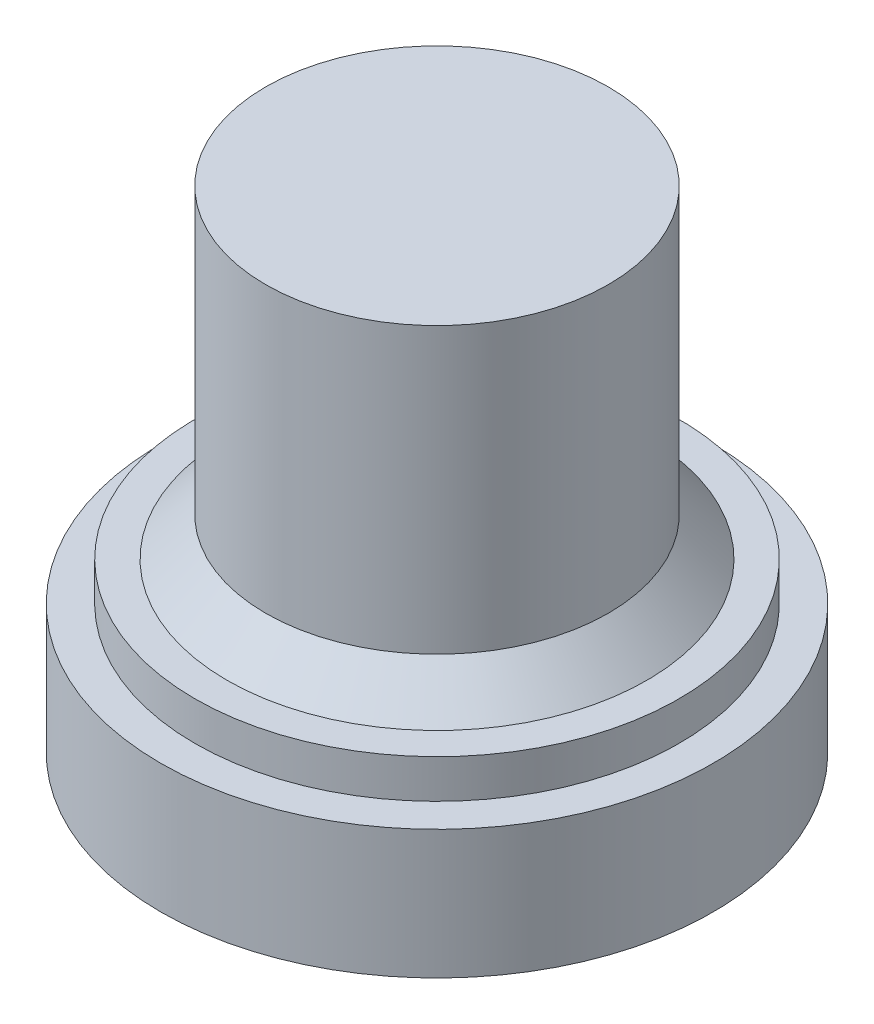
ISO-10303-21;
HEADER;
FILE_DESCRIPTION(('STEP AP214'),'2;1');
FILE_NAME('part.step','',(''),(''),'','','');
FILE_SCHEMA(('AUTOMOTIVE_DESIGN { 1 0 10303 214 1 1 1 1 }'));
ENDSEC;
DATA;
#1=APPLICATION_CONTEXT('core data for automotive mechanical design processes');
#2=APPLICATION_PROTOCOL_DEFINITION('international standard','automotive_design',2000,#1);
#3=PRODUCT_CONTEXT('',#1,'mechanical');
#4=PRODUCT('Part','Part','',(#3));
#5=PRODUCT_RELATED_PRODUCT_CATEGORY('part','',(#4));
#6=PRODUCT_DEFINITION_FORMATION('','',#4);
#7=PRODUCT_DEFINITION_CONTEXT('part definition',#1,'design');
#8=PRODUCT_DEFINITION('design','',#6,#7);
#9=PRODUCT_DEFINITION_SHAPE('','',#8);
#10=(LENGTH_UNIT() NAMED_UNIT(*) SI_UNIT(.MILLI.,.METRE.));
#11=(NAMED_UNIT(*) PLANE_ANGLE_UNIT() SI_UNIT($,.RADIAN.));
#12=(NAMED_UNIT(*) SI_UNIT($,.STERADIAN.) SOLID_ANGLE_UNIT());
#13=UNCERTAINTY_MEASURE_WITH_UNIT(LENGTH_MEASURE(1.E-05),#10,'distance_accuracy_value','');
#14=(GEOMETRIC_REPRESENTATION_CONTEXT(3) GLOBAL_UNCERTAINTY_ASSIGNED_CONTEXT((#13)) GLOBAL_UNIT_ASSIGNED_CONTEXT((#10,
#11,#12)) REPRESENTATION_CONTEXT('',''));
#15=CARTESIAN_POINT('',(0.,0.,0.));
#16=DIRECTION('',(0.,0.,1.));
#17=DIRECTION('',(1.,0.,0.));
#18=AXIS2_PLACEMENT_3D('',#15,#16,#17);
#19=CARTESIAN_POINT('',(0.,9.4742,0.));
#20=DIRECTION('',(0.,-1.,0.));
#21=DIRECTION('',(0.,0.,-1.));
#22=AXIS2_PLACEMENT_3D('',#19,#20,#21);
#23=CONICAL_SURFACE('',#22,7.874,0.785398163397448);
#24=CARTESIAN_POINT('',(0.,9.4742,0.));
#25=DIRECTION('',(0.,1.,0.));
#26=DIRECTION('',(0.,0.,1.));
#27=AXIS2_PLACEMENT_3D('',#24,#25,#26);
#28=CIRCLE('',#27,7.874);
#29=CARTESIAN_POINT('',(0.,9.4742,7.874));
#30=VERTEX_POINT('',#29);
#31=EDGE_CURVE('E40',#30,#30,#28,.T.);
#32=ORIENTED_EDGE('',*,*,#31,.F.);
#33=EDGE_LOOP('',(#32));
#34=FACE_BOUND('',#33,.T.);
#35=CARTESIAN_POINT('',(0.,7.6962,0.));
#36=DIRECTION('',(0.,1.,0.));
#37=DIRECTION('',(0.,0.,1.));
#38=AXIS2_PLACEMENT_3D('',#35,#36,#37);
#39=CIRCLE('',#38,9.652);
#40=CARTESIAN_POINT('',(0.,7.6962,9.652));
#41=VERTEX_POINT('',#40);
#42=EDGE_CURVE('E12',#41,#41,#39,.F.);
#43=ORIENTED_EDGE('',*,*,#42,.F.);
#44=EDGE_LOOP('',(#43));
#45=FACE_BOUND('',#44,.T.);
#46=ADVANCED_FACE('F34',(#34,#45),#23,.T.);
#47=CARTESIAN_POINT('',(0.,5.9182,0.));
#48=DIRECTION('',(0.,-1.,0.));
#49=DIRECTION('',(0.,0.,-1.));
#50=AXIS2_PLACEMENT_3D('',#47,#48,#49);
#51=CYLINDRICAL_SURFACE('',#50,12.7);
#52=CARTESIAN_POINT('',(0.,5.9182,0.));
#53=DIRECTION('',(0.,1.,0.));
#54=DIRECTION('',(0.,0.,1.));
#55=AXIS2_PLACEMENT_3D('',#52,#53,#54);
#56=CIRCLE('',#55,12.7);
#57=CARTESIAN_POINT('',(0.,5.9182,12.7));
#58=VERTEX_POINT('',#57);
#59=EDGE_CURVE('E48',#58,#58,#56,.T.);
#60=ORIENTED_EDGE('',*,*,#59,.F.);
#61=EDGE_LOOP('',(#60));
#62=FACE_BOUND('',#61,.T.);
#63=CARTESIAN_POINT('',(0.,0.,0.));
#64=DIRECTION('',(0.,1.,0.));
#65=DIRECTION('',(0.,0.,1.));
#66=AXIS2_PLACEMENT_3D('',#63,#64,#65);
#67=CIRCLE('',#66,12.7);
#68=CARTESIAN_POINT('',(0.,0.,12.7));
#69=VERTEX_POINT('',#68);
#70=EDGE_CURVE('E51',#69,#69,#67,.T.);
#71=ORIENTED_EDGE('',*,*,#70,.T.);
#72=EDGE_LOOP('',(#71));
#73=FACE_BOUND('',#72,.T.);
#74=ADVANCED_FACE('F77',(#62,#73),#51,.T.);
#75=CARTESIAN_POINT('',(0.,5.9182,0.));
#76=DIRECTION('',(0.,1.,0.));
#77=DIRECTION('',(0.,0.,1.));
#78=AXIS2_PLACEMENT_3D('',#75,#76,#77);
#79=PLANE('',#78);
#80=CARTESIAN_POINT('',(0.,5.9182,0.));
#81=DIRECTION('',(0.,1.,0.));
#82=DIRECTION('',(0.,0.,1.));
#83=AXIS2_PLACEMENT_3D('',#80,#81,#82);
#84=CIRCLE('',#83,11.1252);
#85=CARTESIAN_POINT('',(0.,5.9182,11.1252));
#86=VERTEX_POINT('',#85);
#87=EDGE_CURVE('E44',#86,#86,#84,.T.);
#88=ORIENTED_EDGE('',*,*,#87,.F.);
#89=EDGE_LOOP('',(#88));
#90=FACE_BOUND('',#89,.T.);
#91=ORIENTED_EDGE('',*,*,#59,.T.);
#92=EDGE_LOOP('',(#91));
#93=FACE_BOUND('',#92,.T.);
#94=ADVANCED_FACE('F82',(#90,#93),#79,.T.);
#95=CARTESIAN_POINT('',(0.,0.,0.));
#96=DIRECTION('',(0.,1.,0.));
#97=DIRECTION('',(0.,0.,1.));
#98=AXIS2_PLACEMENT_3D('',#95,#96,#97);
#99=PLANE('',#98);
#100=ORIENTED_EDGE('',*,*,#70,.F.);
#101=EDGE_LOOP('',(#100));
#102=FACE_BOUND('',#101,.T.);
#103=ADVANCED_FACE('F88',(#102),#99,.F.);
#104=CARTESIAN_POINT('',(0.,7.6962,0.));
#105=DIRECTION('',(0.,-1.,0.));
#106=DIRECTION('',(0.,0.,-1.));
#107=AXIS2_PLACEMENT_3D('',#104,#105,#106);
#108=CYLINDRICAL_SURFACE('',#107,11.1252);
#109=CARTESIAN_POINT('',(0.,7.6962,0.));
#110=DIRECTION('',(0.,1.,0.));
#111=DIRECTION('',(0.,0.,1.));
#112=AXIS2_PLACEMENT_3D('',#109,#110,#111);
#113=CIRCLE('',#112,11.1252);
#114=CARTESIAN_POINT('',(0.,7.6962,11.1252));
#115=VERTEX_POINT('',#114);
#116=EDGE_CURVE('E54',#115,#115,#113,.T.);
#117=ORIENTED_EDGE('',*,*,#116,.F.);
#118=EDGE_LOOP('',(#117));
#119=FACE_BOUND('',#118,.T.);
#120=ORIENTED_EDGE('',*,*,#87,.T.);
#121=EDGE_LOOP('',(#120));
#122=FACE_BOUND('',#121,.T.);
#123=ADVANCED_FACE('F74',(#119,#122),#108,.T.);
#124=CARTESIAN_POINT('',(0.,7.6962,0.));
#125=DIRECTION('',(0.,1.,0.));
#126=DIRECTION('',(0.,0.,1.));
#127=AXIS2_PLACEMENT_3D('',#124,#125,#126);
#128=PLANE('',#127);
#129=ORIENTED_EDGE('',*,*,#42,.T.);
#130=EDGE_LOOP('',(#129));
#131=FACE_BOUND('',#130,.T.);
#132=ORIENTED_EDGE('',*,*,#116,.T.);
#133=EDGE_LOOP('',(#132));
#134=FACE_BOUND('',#133,.T.);
#135=ADVANCED_FACE('F67',(#131,#134),#128,.T.);
#136=CARTESIAN_POINT('',(0.,22.5552,0.));
#137=DIRECTION('',(0.,-1.,0.));
#138=DIRECTION('',(0.,0.,-1.));
#139=AXIS2_PLACEMENT_3D('',#136,#137,#138);
#140=CYLINDRICAL_SURFACE('',#139,7.874);
#141=ORIENTED_EDGE('',*,*,#31,.T.);
#142=EDGE_LOOP('',(#141));
#143=FACE_BOUND('',#142,.T.);
#144=CARTESIAN_POINT('',(0.,22.5552,0.));
#145=DIRECTION('',(0.,1.,0.));
#146=DIRECTION('',(0.,0.,1.));
#147=AXIS2_PLACEMENT_3D('',#144,#145,#146);
#148=CIRCLE('',#147,7.874);
#149=CARTESIAN_POINT('',(0.,22.5552,7.874));
#150=VERTEX_POINT('',#149);
#151=EDGE_CURVE('E59',#150,#150,#148,.T.);
#152=ORIENTED_EDGE('',*,*,#151,.F.);
#153=EDGE_LOOP('',(#152));
#154=FACE_BOUND('',#153,.T.);
#155=ADVANCED_FACE('F65',(#143,#154),#140,.T.);
#156=CARTESIAN_POINT('',(0.,22.5552,0.));
#157=DIRECTION('',(0.,1.,0.));
#158=DIRECTION('',(0.,0.,1.));
#159=AXIS2_PLACEMENT_3D('',#156,#157,#158);
#160=PLANE('',#159);
#161=ORIENTED_EDGE('',*,*,#151,.T.);
#162=EDGE_LOOP('',(#161));
#163=FACE_BOUND('',#162,.T.);
#164=ADVANCED_FACE('F63',(#163),#160,.T.);
#165=CLOSED_SHELL('',(#46,#74,#94,#103,#123,#135,#155,#164));
#166=MANIFOLD_SOLID_BREP('B2',#165);
#167=ADVANCED_BREP_SHAPE_REPRESENTATION('',(#18,#166),#14);
#168=SHAPE_DEFINITION_REPRESENTATION(#9,#167);
ENDSEC;
END-ISO-10303-21;
